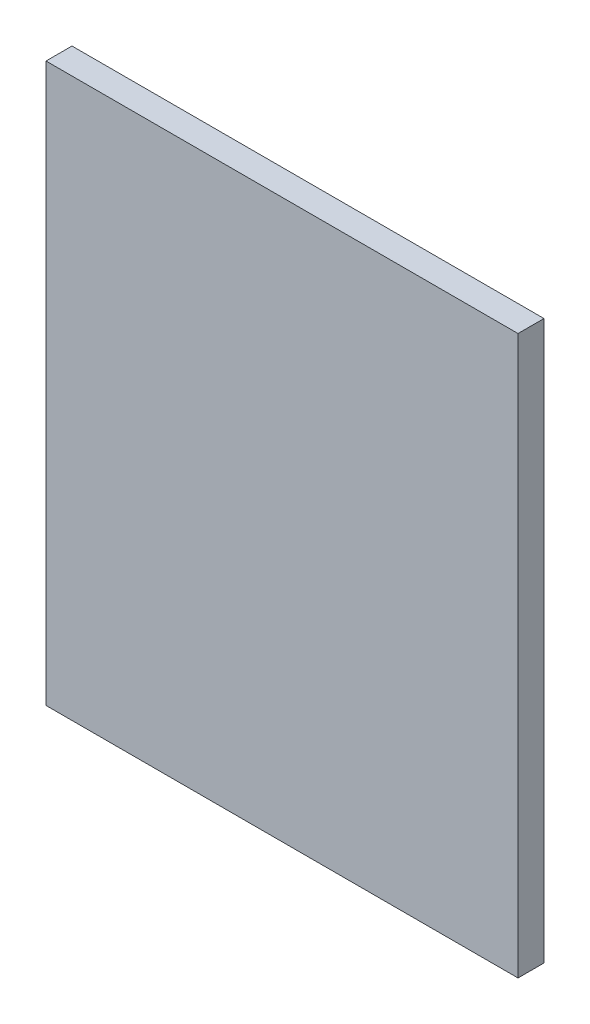
ISO-10303-21;
HEADER;
FILE_DESCRIPTION(('STEP AP214'),'2;1');
FILE_NAME('part.step','',(''),(''),'','','');
FILE_SCHEMA(('AUTOMOTIVE_DESIGN { 1 0 10303 214 1 1 1 1 }'));
ENDSEC;
DATA;
#1=APPLICATION_CONTEXT('core data for automotive mechanical design processes');
#2=APPLICATION_PROTOCOL_DEFINITION('international standard','automotive_design',2000,#1);
#3=PRODUCT_CONTEXT('',#1,'mechanical');
#4=PRODUCT('Part','Part','',(#3));
#5=PRODUCT_RELATED_PRODUCT_CATEGORY('part','',(#4));
#6=PRODUCT_DEFINITION_FORMATION('','',#4);
#7=PRODUCT_DEFINITION_CONTEXT('part definition',#1,'design');
#8=PRODUCT_DEFINITION('design','',#6,#7);
#9=PRODUCT_DEFINITION_SHAPE('','',#8);
#10=(LENGTH_UNIT() NAMED_UNIT(*) SI_UNIT(.MILLI.,.METRE.));
#11=(NAMED_UNIT(*) PLANE_ANGLE_UNIT() SI_UNIT($,.RADIAN.));
#12=(NAMED_UNIT(*) SI_UNIT($,.STERADIAN.) SOLID_ANGLE_UNIT());
#13=UNCERTAINTY_MEASURE_WITH_UNIT(LENGTH_MEASURE(1.E-05),#10,'distance_accuracy_value','');
#14=(GEOMETRIC_REPRESENTATION_CONTEXT(3) GLOBAL_UNCERTAINTY_ASSIGNED_CONTEXT((#13)) GLOBAL_UNIT_ASSIGNED_CONTEXT((#10,
#11,#12)) REPRESENTATION_CONTEXT('',''));
#15=CARTESIAN_POINT('',(0.,0.,0.));
#16=DIRECTION('',(0.,0.,1.));
#17=DIRECTION('',(1.,0.,0.));
#18=AXIS2_PLACEMENT_3D('',#15,#16,#17);
#19=CARTESIAN_POINT('',(-2.452497,2.89999928,0.26999946));
#20=DIRECTION('',(0.,0.,-1.));
#21=DIRECTION('',(-1.,0.,0.));
#22=AXIS2_PLACEMENT_3D('',#19,#20,#21);
#23=PLANE('',#22);
#24=DIRECTION('',(0.,1.,0.));
#25=VECTOR('',#24,1.);
#26=CARTESIAN_POINT('',(2.45249954,-2.89999928,0.26999946));
#27=LINE('',#26,#25);
#28=CARTESIAN_POINT('',(2.45249954,-2.89999928,0.26999946));
#29=VERTEX_POINT('',#28);
#30=CARTESIAN_POINT('',(2.45249954,2.89999928,0.26999946));
#31=VERTEX_POINT('',#30);
#32=EDGE_CURVE('E80',#29,#31,#27,.T.);
#33=ORIENTED_EDGE('',*,*,#32,.T.);
#34=DIRECTION('',(1.,0.,0.));
#35=VECTOR('',#34,1.);
#36=CARTESIAN_POINT('',(2.45249954,2.89999928,0.26999946));
#37=LINE('',#36,#35);
#38=CARTESIAN_POINT('',(-2.452497,2.89999928,0.26999946));
#39=VERTEX_POINT('',#38);
#40=EDGE_CURVE('E55',#31,#39,#37,.F.);
#41=ORIENTED_EDGE('',*,*,#40,.T.);
#42=DIRECTION('',(0.,1.,0.));
#43=VECTOR('',#42,1.);
#44=CARTESIAN_POINT('',(-2.452497,2.89999928,0.26999946));
#45=LINE('',#44,#43);
#46=CARTESIAN_POINT('',(-2.452497,-2.89999928,0.26999946));
#47=VERTEX_POINT('',#46);
#48=EDGE_CURVE('E57',#39,#47,#45,.F.);
#49=ORIENTED_EDGE('',*,*,#48,.T.);
#50=DIRECTION('',(1.,0.,0.));
#51=VECTOR('',#50,1.);
#52=CARTESIAN_POINT('',(-2.452497,-2.89999928,0.26999946));
#53=LINE('',#52,#51);
#54=EDGE_CURVE('E20',#47,#29,#53,.T.);
#55=ORIENTED_EDGE('',*,*,#54,.T.);
#56=EDGE_LOOP('',(#33,#41,#49,#55));
#57=FACE_BOUND('',#56,.T.);
#58=ADVANCED_FACE('F17',(#57),#23,.F.);
#59=CARTESIAN_POINT('',(-2.452497,-2.89999928,0.));
#60=DIRECTION('',(0.,1.,0.));
#61=DIRECTION('',(0.,0.,1.));
#62=AXIS2_PLACEMENT_3D('',#59,#60,#61);
#63=PLANE('',#62);
#64=ORIENTED_EDGE('',*,*,#54,.F.);
#65=DIRECTION('',(0.,0.,-1.));
#66=VECTOR('',#65,1.);
#67=CARTESIAN_POINT('',(-2.452497,-2.89999928,0.));
#68=LINE('',#67,#66);
#69=CARTESIAN_POINT('',(-2.452497,-2.89999928,0.));
#70=VERTEX_POINT('',#69);
#71=EDGE_CURVE('E63',#47,#70,#68,.T.);
#72=ORIENTED_EDGE('',*,*,#71,.T.);
#73=DIRECTION('',(-1.,0.,0.));
#74=VECTOR('',#73,1.);
#75=CARTESIAN_POINT('',(-2.452497,-2.89999928,0.));
#76=LINE('',#75,#74);
#77=CARTESIAN_POINT('',(2.45249954,-2.89999928,0.));
#78=VERTEX_POINT('',#77);
#79=EDGE_CURVE('E83',#78,#70,#76,.T.);
#80=ORIENTED_EDGE('',*,*,#79,.F.);
#81=DIRECTION('',(0.,0.,1.));
#82=VECTOR('',#81,1.);
#83=CARTESIAN_POINT('',(2.45249954,-2.89999928,0.));
#84=LINE('',#83,#82);
#85=EDGE_CURVE('E68',#78,#29,#84,.T.);
#86=ORIENTED_EDGE('',*,*,#85,.T.);
#87=EDGE_LOOP('',(#64,#72,#80,#86));
#88=FACE_BOUND('',#87,.T.);
#89=ADVANCED_FACE('F65',(#88),#63,.F.);
#90=CARTESIAN_POINT('',(-2.452497,2.89999928,0.));
#91=DIRECTION('',(1.,0.,0.));
#92=DIRECTION('',(0.,0.,-1.));
#93=AXIS2_PLACEMENT_3D('',#90,#91,#92);
#94=PLANE('',#93);
#95=ORIENTED_EDGE('',*,*,#48,.F.);
#96=DIRECTION('',(0.,0.,-1.));
#97=VECTOR('',#96,1.);
#98=CARTESIAN_POINT('',(-2.452497,2.89999928,0.));
#99=LINE('',#98,#97);
#100=CARTESIAN_POINT('',(-2.452497,2.89999928,0.));
#101=VERTEX_POINT('',#100);
#102=EDGE_CURVE('E75',#39,#101,#99,.T.);
#103=ORIENTED_EDGE('',*,*,#102,.T.);
#104=DIRECTION('',(0.,1.,0.));
#105=VECTOR('',#104,1.);
#106=CARTESIAN_POINT('',(-2.452497,2.89999928,0.));
#107=LINE('',#106,#105);
#108=EDGE_CURVE('E72',#70,#101,#107,.T.);
#109=ORIENTED_EDGE('',*,*,#108,.F.);
#110=ORIENTED_EDGE('',*,*,#71,.F.);
#111=EDGE_LOOP('',(#95,#103,#109,#110));
#112=FACE_BOUND('',#111,.T.);
#113=ADVANCED_FACE('F70',(#112),#94,.F.);
#114=CARTESIAN_POINT('',(2.45249954,2.89999928,0.));
#115=DIRECTION('',(0.,-1.,0.));
#116=DIRECTION('',(0.,0.,-1.));
#117=AXIS2_PLACEMENT_3D('',#114,#115,#116);
#118=PLANE('',#117);
#119=ORIENTED_EDGE('',*,*,#40,.F.);
#120=DIRECTION('',(0.,0.,1.));
#121=VECTOR('',#120,1.);
#122=CARTESIAN_POINT('',(2.45249954,2.89999928,0.));
#123=LINE('',#122,#121);
#124=CARTESIAN_POINT('',(2.45249954,2.89999928,0.));
#125=VERTEX_POINT('',#124);
#126=EDGE_CURVE('E35',#31,#125,#123,.F.);
#127=ORIENTED_EDGE('',*,*,#126,.T.);
#128=DIRECTION('',(-1.,0.,0.));
#129=VECTOR('',#128,1.);
#130=CARTESIAN_POINT('',(-2.452497,2.89999928,0.));
#131=LINE('',#130,#129);
#132=EDGE_CURVE('E26',#101,#125,#131,.F.);
#133=ORIENTED_EDGE('',*,*,#132,.F.);
#134=ORIENTED_EDGE('',*,*,#102,.F.);
#135=EDGE_LOOP('',(#119,#127,#133,#134));
#136=FACE_BOUND('',#135,.T.);
#137=ADVANCED_FACE('F89',(#136),#118,.F.);
#138=CARTESIAN_POINT('',(2.45249954,-2.89999928,0.));
#139=DIRECTION('',(-1.,0.,0.));
#140=DIRECTION('',(0.,0.,1.));
#141=AXIS2_PLACEMENT_3D('',#138,#139,#140);
#142=PLANE('',#141);
#143=ORIENTED_EDGE('',*,*,#32,.F.);
#144=ORIENTED_EDGE('',*,*,#85,.F.);
#145=DIRECTION('',(0.,1.,0.));
#146=VECTOR('',#145,1.);
#147=CARTESIAN_POINT('',(2.45249954,2.89999928,0.));
#148=LINE('',#147,#146);
#149=EDGE_CURVE('E11',#125,#78,#148,.F.);
#150=ORIENTED_EDGE('',*,*,#149,.F.);
#151=ORIENTED_EDGE('',*,*,#126,.F.);
#152=EDGE_LOOP('',(#143,#144,#150,#151));
#153=FACE_BOUND('',#152,.T.);
#154=ADVANCED_FACE('F91',(#153),#142,.F.);
#155=CARTESIAN_POINT('',(-2.452497,2.89999928,0.));
#156=DIRECTION('',(0.,0.,-1.));
#157=DIRECTION('',(-1.,0.,0.));
#158=AXIS2_PLACEMENT_3D('',#155,#156,#157);
#159=PLANE('',#158);
#160=ORIENTED_EDGE('',*,*,#132,.T.);
#161=ORIENTED_EDGE('',*,*,#149,.T.);
#162=ORIENTED_EDGE('',*,*,#79,.T.);
#163=ORIENTED_EDGE('',*,*,#108,.T.);
#164=EDGE_LOOP('',(#160,#161,#162,#163));
#165=FACE_BOUND('',#164,.T.);
#166=ADVANCED_FACE('F88',(#165),#159,.T.);
#167=CLOSED_SHELL('',(#58,#89,#113,#137,#154,#166));
#168=MANIFOLD_SOLID_BREP('B1',#167);
#169=ADVANCED_BREP_SHAPE_REPRESENTATION('',(#18,#168),#14);
#170=SHAPE_DEFINITION_REPRESENTATION(#9,#169);
ENDSEC;
END-ISO-10303-21;
